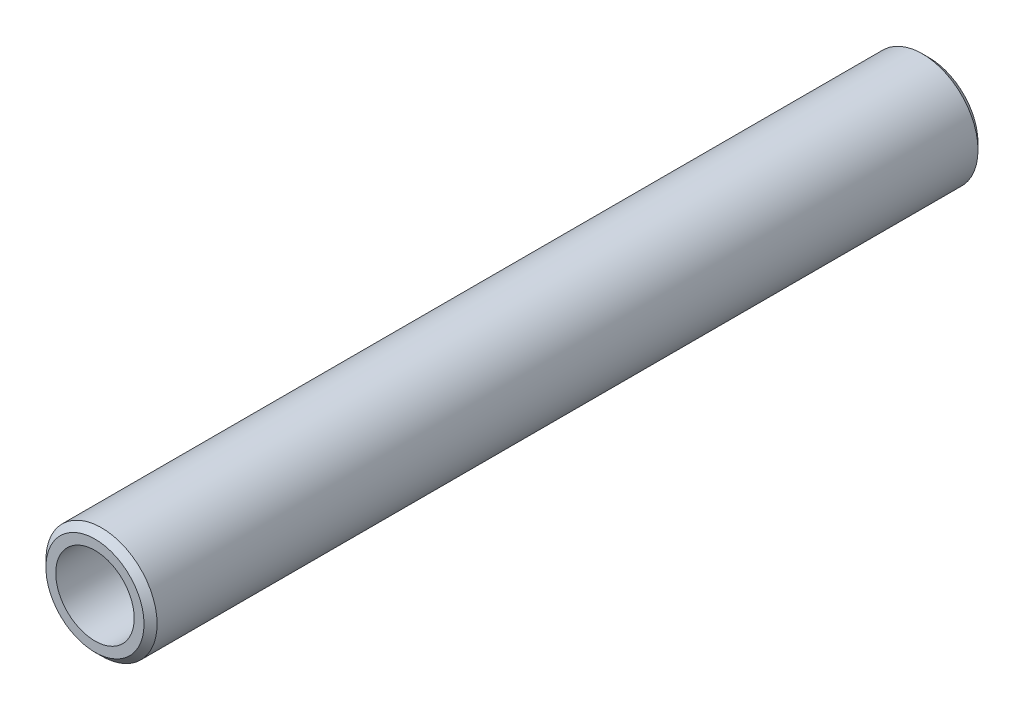
ISO-10303-21;
HEADER;
FILE_DESCRIPTION(('STEP AP214'),'2;1');
FILE_NAME('part.step','',(''),(''),'','','');
FILE_SCHEMA(('AUTOMOTIVE_DESIGN { 1 0 10303 214 1 1 1 1 }'));
ENDSEC;
DATA;
#1=APPLICATION_CONTEXT('core data for automotive mechanical design processes');
#2=APPLICATION_PROTOCOL_DEFINITION('international standard','automotive_design',2000,#1);
#3=PRODUCT_CONTEXT('',#1,'mechanical');
#4=PRODUCT('Part','Part','',(#3));
#5=PRODUCT_RELATED_PRODUCT_CATEGORY('part','',(#4));
#6=PRODUCT_DEFINITION_FORMATION('','',#4);
#7=PRODUCT_DEFINITION_CONTEXT('part definition',#1,'design');
#8=PRODUCT_DEFINITION('design','',#6,#7);
#9=PRODUCT_DEFINITION_SHAPE('','',#8);
#10=(LENGTH_UNIT() NAMED_UNIT(*) SI_UNIT(.MILLI.,.METRE.));
#11=(NAMED_UNIT(*) PLANE_ANGLE_UNIT() SI_UNIT($,.RADIAN.));
#12=(NAMED_UNIT(*) SI_UNIT($,.STERADIAN.) SOLID_ANGLE_UNIT());
#13=UNCERTAINTY_MEASURE_WITH_UNIT(LENGTH_MEASURE(1.E-05),#10,'distance_accuracy_value','');
#14=(GEOMETRIC_REPRESENTATION_CONTEXT(3) GLOBAL_UNCERTAINTY_ASSIGNED_CONTEXT((#13)) GLOBAL_UNIT_ASSIGNED_CONTEXT((#10,
#11,#12)) REPRESENTATION_CONTEXT('',''));
#15=CARTESIAN_POINT('',(0.,0.,0.));
#16=DIRECTION('',(0.,0.,1.));
#17=DIRECTION('',(1.,0.,0.));
#18=AXIS2_PLACEMENT_3D('',#15,#16,#17);
#19=CARTESIAN_POINT('',(0.,0.,255.));
#20=DIRECTION('',(0.,0.,-1.));
#21=DIRECTION('',(-1.,0.,0.));
#22=AXIS2_PLACEMENT_3D('',#19,#20,#21);
#23=CYLINDRICAL_SURFACE('',#22,12.);
#24=CARTESIAN_POINT('',(0.,0.,255.));
#25=DIRECTION('',(0.,0.,1.));
#26=DIRECTION('',(1.,0.,0.));
#27=AXIS2_PLACEMENT_3D('',#24,#25,#26);
#28=CIRCLE('',#27,12.);
#29=CARTESIAN_POINT('',(12.,0.,255.));
#30=VERTEX_POINT('',#29);
#31=EDGE_CURVE('E51',#30,#30,#28,.T.);
#32=ORIENTED_EDGE('',*,*,#31,.T.);
#33=EDGE_LOOP('',(#32));
#34=FACE_BOUND('',#33,.T.);
#35=CARTESIAN_POINT('',(0.,0.,0.));
#36=DIRECTION('',(0.,0.,1.));
#37=DIRECTION('',(1.,0.,0.));
#38=AXIS2_PLACEMENT_3D('',#35,#36,#37);
#39=CIRCLE('',#38,12.);
#40=CARTESIAN_POINT('',(12.,0.,0.));
#41=VERTEX_POINT('',#40);
#42=EDGE_CURVE('E52',#41,#41,#39,.T.);
#43=ORIENTED_EDGE('',*,*,#42,.F.);
#44=EDGE_LOOP('',(#43));
#45=FACE_BOUND('',#44,.T.);
#46=ADVANCED_FACE('F31',(#34,#45),#23,.F.);
#47=CARTESIAN_POINT('',(0.,0.,255.));
#48=DIRECTION('',(0.,0.,-1.));
#49=DIRECTION('',(-1.,0.,0.));
#50=AXIS2_PLACEMENT_3D('',#47,#48,#49);
#51=CYLINDRICAL_SURFACE('',#50,17.);
#52=CARTESIAN_POINT('',(0.,0.,2.));
#53=DIRECTION('',(0.,0.,1.));
#54=DIRECTION('',(1.,0.,0.));
#55=AXIS2_PLACEMENT_3D('',#52,#53,#54);
#56=CIRCLE('',#55,17.);
#57=CARTESIAN_POINT('',(17.,0.,2.));
#58=VERTEX_POINT('',#57);
#59=EDGE_CURVE('E42',#58,#58,#56,.T.);
#60=ORIENTED_EDGE('',*,*,#59,.T.);
#61=EDGE_LOOP('',(#60));
#62=FACE_BOUND('',#61,.T.);
#63=CARTESIAN_POINT('',(0.,0.,253.));
#64=DIRECTION('',(0.,0.,1.));
#65=DIRECTION('',(1.,0.,0.));
#66=AXIS2_PLACEMENT_3D('',#63,#64,#65);
#67=CIRCLE('',#66,17.);
#68=CARTESIAN_POINT('',(17.,0.,253.));
#69=VERTEX_POINT('',#68);
#70=EDGE_CURVE('E46',#69,#69,#67,.F.);
#71=ORIENTED_EDGE('',*,*,#70,.T.);
#72=EDGE_LOOP('',(#71));
#73=FACE_BOUND('',#72,.T.);
#74=ADVANCED_FACE('F63',(#62,#73),#51,.T.);
#75=CARTESIAN_POINT('',(0.,0.,255.));
#76=DIRECTION('',(0.,0.,1.));
#77=DIRECTION('',(1.,0.,0.));
#78=AXIS2_PLACEMENT_3D('',#75,#76,#77);
#79=PLANE('',#78);
#80=CARTESIAN_POINT('',(0.,0.,255.));
#81=DIRECTION('',(0.,0.,1.));
#82=DIRECTION('',(1.,0.,0.));
#83=AXIS2_PLACEMENT_3D('',#80,#81,#82);
#84=CIRCLE('',#83,15.);
#85=CARTESIAN_POINT('',(15.,0.,255.));
#86=VERTEX_POINT('',#85);
#87=EDGE_CURVE('E10',#86,#86,#84,.T.);
#88=ORIENTED_EDGE('',*,*,#87,.T.);
#89=EDGE_LOOP('',(#88));
#90=FACE_BOUND('',#89,.T.);
#91=ORIENTED_EDGE('',*,*,#31,.F.);
#92=EDGE_LOOP('',(#91));
#93=FACE_BOUND('',#92,.T.);
#94=ADVANCED_FACE('F60',(#90,#93),#79,.T.);
#95=CARTESIAN_POINT('',(0.,0.,0.));
#96=DIRECTION('',(0.,0.,1.));
#97=DIRECTION('',(1.,0.,0.));
#98=AXIS2_PLACEMENT_3D('',#95,#96,#97);
#99=PLANE('',#98);
#100=CARTESIAN_POINT('',(0.,0.,0.));
#101=DIRECTION('',(0.,0.,1.));
#102=DIRECTION('',(1.,0.,0.));
#103=AXIS2_PLACEMENT_3D('',#100,#101,#102);
#104=CIRCLE('',#103,15.);
#105=CARTESIAN_POINT('',(15.,0.,0.));
#106=VERTEX_POINT('',#105);
#107=EDGE_CURVE('E38',#106,#106,#104,.F.);
#108=ORIENTED_EDGE('',*,*,#107,.T.);
#109=EDGE_LOOP('',(#108));
#110=FACE_BOUND('',#109,.T.);
#111=ORIENTED_EDGE('',*,*,#42,.T.);
#112=EDGE_LOOP('',(#111));
#113=FACE_BOUND('',#112,.T.);
#114=ADVANCED_FACE('F62',(#110,#113),#99,.F.);
#115=CARTESIAN_POINT('',(0.,0.,2.));
#116=DIRECTION('',(0.,0.,1.));
#117=DIRECTION('',(1.,0.,0.));
#118=AXIS2_PLACEMENT_3D('',#115,#116,#117);
#119=CONICAL_SURFACE('',#118,17.,0.785398163397445);
#120=ORIENTED_EDGE('',*,*,#107,.F.);
#121=EDGE_LOOP('',(#120));
#122=FACE_BOUND('',#121,.T.);
#123=ORIENTED_EDGE('',*,*,#59,.F.);
#124=EDGE_LOOP('',(#123));
#125=FACE_BOUND('',#124,.T.);
#126=ADVANCED_FACE('F69',(#122,#125),#119,.T.);
#127=CARTESIAN_POINT('',(0.,0.,255.));
#128=DIRECTION('',(0.,0.,-1.));
#129=DIRECTION('',(-1.,0.,0.));
#130=AXIS2_PLACEMENT_3D('',#127,#128,#129);
#131=CONICAL_SURFACE('',#130,15.,0.785398163397445);
#132=ORIENTED_EDGE('',*,*,#70,.F.);
#133=EDGE_LOOP('',(#132));
#134=FACE_BOUND('',#133,.T.);
#135=ORIENTED_EDGE('',*,*,#87,.F.);
#136=EDGE_LOOP('',(#135));
#137=FACE_BOUND('',#136,.T.);
#138=ADVANCED_FACE('F33',(#134,#137),#131,.T.);
#139=CLOSED_SHELL('',(#46,#74,#94,#114,#126,#138));
#140=MANIFOLD_SOLID_BREP('B2',#139);
#141=ADVANCED_BREP_SHAPE_REPRESENTATION('',(#18,#140),#14);
#142=SHAPE_DEFINITION_REPRESENTATION(#9,#141);
ENDSEC;
END-ISO-10303-21;
